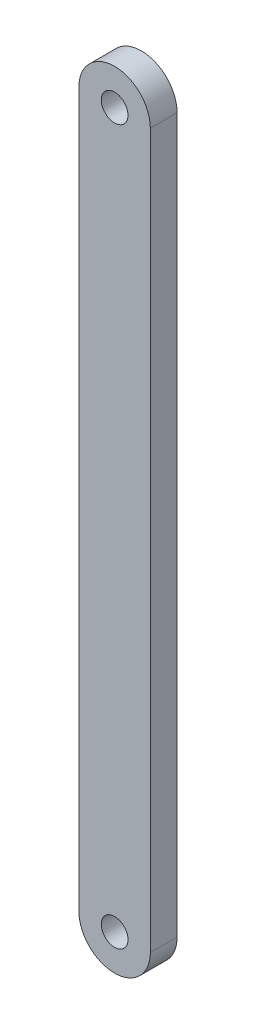
ISO-10303-21;
HEADER;
FILE_DESCRIPTION(('STEP AP214'),'2;1');
FILE_NAME('part.step','',(''),(''),'','','');
FILE_SCHEMA(('AUTOMOTIVE_DESIGN { 1 0 10303 214 1 1 1 1 }'));
ENDSEC;
DATA;
#1=APPLICATION_CONTEXT('core data for automotive mechanical design processes');
#2=APPLICATION_PROTOCOL_DEFINITION('international standard','automotive_design',2000,#1);
#3=PRODUCT_CONTEXT('',#1,'mechanical');
#4=PRODUCT('Part','Part','',(#3));
#5=PRODUCT_RELATED_PRODUCT_CATEGORY('part','',(#4));
#6=PRODUCT_DEFINITION_FORMATION('','',#4);
#7=PRODUCT_DEFINITION_CONTEXT('part definition',#1,'design');
#8=PRODUCT_DEFINITION('design','',#6,#7);
#9=PRODUCT_DEFINITION_SHAPE('','',#8);
#10=(LENGTH_UNIT() NAMED_UNIT(*) SI_UNIT(.MILLI.,.METRE.));
#11=(NAMED_UNIT(*) PLANE_ANGLE_UNIT() SI_UNIT($,.RADIAN.));
#12=(NAMED_UNIT(*) SI_UNIT($,.STERADIAN.) SOLID_ANGLE_UNIT());
#13=UNCERTAINTY_MEASURE_WITH_UNIT(LENGTH_MEASURE(1.E-05),#10,'distance_accuracy_value','');
#14=(GEOMETRIC_REPRESENTATION_CONTEXT(3) GLOBAL_UNCERTAINTY_ASSIGNED_CONTEXT((#13)) GLOBAL_UNIT_ASSIGNED_CONTEXT((#10,
#11,#12)) REPRESENTATION_CONTEXT('',''));
#15=CARTESIAN_POINT('',(0.,0.,0.));
#16=DIRECTION('',(0.,0.,1.));
#17=DIRECTION('',(1.,0.,0.));
#18=AXIS2_PLACEMENT_3D('',#15,#16,#17);
#19=CARTESIAN_POINT('',(44.3000999967361,0.999999998024384,3.));
#20=DIRECTION('',(0.,0.,-1.));
#21=DIRECTION('',(-1.,0.,0.));
#22=AXIS2_PLACEMENT_3D('',#19,#20,#21);
#23=PLANE('',#22);
#24=CARTESIAN_POINT('',(40.3000999980244,5.000000005807,3.));
#25=CARTESIAN_POINT('',(40.3000999936778,2.65685425240754,3.));
#26=CARTESIAN_POINT('',(41.9569542433365,0.999999998991616,3.));
#27=CARTESIAN_POINT('',(44.3000999967361,0.999999998024384,3.));
#28=CARTESIAN_POINT('',(46.6432457501358,0.999999997057152,3.));
#29=CARTESIAN_POINT('',(48.3001000011623,2.65685424910521,3.));
#30=CARTESIAN_POINT('',(48.3000999987502,5.00000000250467,3.));
#31=(BOUNDED_CURVE() B_SPLINE_CURVE(3,(#24,#25,#26,#27,#28,#29,#30),.UNSPECIFIED.,.F.,
.F.) B_SPLINE_CURVE_WITH_KNOTS((4,3,4),(0.,0.5,1.),
.UNSPECIFIED.) CURVE() GEOMETRIC_REPRESENTATION_ITEM() RATIONAL_B_SPLINE_CURVE((1.,
0.80473785378443,0.80473785378443,1.,0.80473785378443,0.80473785378443,1.)) REPRESENTATION_ITEM(''));
#32=CARTESIAN_POINT('',(40.3000999980244,5.000000005807,3.));
#33=VERTEX_POINT('',#32);
#34=CARTESIAN_POINT('',(48.3000999987502,5.00000000250467,3.));
#35=VERTEX_POINT('',#34);
#36=EDGE_CURVE('E85',#33,#35,#31,.T.);
#37=ORIENTED_EDGE('',*,*,#36,.T.);
#38=DIRECTION('',(3.27697938242219E-12,1.,0.));
#39=VECTOR('',#38,1.);
#40=CARTESIAN_POINT('',(48.3000999990123,84.9999999993749,3.));
#41=LINE('',#40,#39);
#42=CARTESIAN_POINT('',(48.3000999990123,84.9999999993749,3.));
#43=VERTEX_POINT('',#42);
#44=EDGE_CURVE('E80',#35,#43,#41,.T.);
#45=ORIENTED_EDGE('',*,*,#44,.T.);
#46=CARTESIAN_POINT('',(44.3000999983873,84.9999999983869,3.));
#47=DIRECTION('',(0.,0.,1.));
#48=DIRECTION('',(1.,0.,0.));
#49=AXIS2_PLACEMENT_3D('',#46,#47,#48);
#50=CIRCLE('',#49,4.00000000062505);
#51=CARTESIAN_POINT('',(40.3000999990123,85.000099999983,3.));
#52=VERTEX_POINT('',#51);
#53=EDGE_CURVE('E83',#43,#52,#50,.T.);
#54=ORIENTED_EDGE('',*,*,#53,.T.);
#55=DIRECTION('',(-1.23485268928075E-11,-1.,0.));
#56=VECTOR('',#55,1.);
#57=CARTESIAN_POINT('',(40.3000999980244,5.000000005807,3.));
#58=LINE('',#57,#56);
#59=EDGE_CURVE('E50',#52,#33,#58,.T.);
#60=ORIENTED_EDGE('',*,*,#59,.T.);
#61=EDGE_LOOP('',(#37,#45,#54,#60));
#62=FACE_BOUND('',#61,.T.);
#63=CARTESIAN_POINT('',(44.3000999983873,4.99999999838695,3.));
#64=DIRECTION('',(0.,0.,1.));
#65=DIRECTION('',(1.,0.,0.));
#66=AXIS2_PLACEMENT_3D('',#63,#64,#65);
#67=CIRCLE('',#66,1.50000000000001);
#68=CARTESIAN_POINT('',(45.8000999983873,4.99999999838695,3.));
#69=VERTEX_POINT('',#68);
#70=EDGE_CURVE('E102',#69,#69,#67,.T.);
#71=ORIENTED_EDGE('',*,*,#70,.F.);
#72=EDGE_LOOP('',(#71));
#73=FACE_BOUND('',#72,.T.);
#74=CARTESIAN_POINT('',(44.3000999983873,84.9999999983869,3.));
#75=DIRECTION('',(0.,0.,1.));
#76=DIRECTION('',(1.,0.,0.));
#77=AXIS2_PLACEMENT_3D('',#74,#75,#76);
#78=CIRCLE('',#77,1.50000000000001);
#79=CARTESIAN_POINT('',(45.8000999983873,84.9999999983869,3.));
#80=VERTEX_POINT('',#79);
#81=EDGE_CURVE('E125',#80,#80,#78,.T.);
#82=ORIENTED_EDGE('',*,*,#81,.F.);
#83=EDGE_LOOP('',(#82));
#84=FACE_BOUND('',#83,.T.);
#85=ADVANCED_FACE('F33',(#62,#73,#84),#23,.F.);
#86=CARTESIAN_POINT('',(44.3000999967361,0.999999998024384,0.));
#87=DIRECTION('',(0.,0.,-1.));
#88=DIRECTION('',(-1.,0.,0.));
#89=AXIS2_PLACEMENT_3D('',#86,#87,#88);
#90=PLANE('',#89);
#91=CARTESIAN_POINT('',(44.3000999983873,4.99999999838695,0.));
#92=DIRECTION('',(0.,0.,1.));
#93=DIRECTION('',(1.,0.,0.));
#94=AXIS2_PLACEMENT_3D('',#91,#92,#93);
#95=CIRCLE('',#94,1.50000000000001);
#96=CARTESIAN_POINT('',(45.8000999983873,4.99999999838695,0.));
#97=VERTEX_POINT('',#96);
#98=EDGE_CURVE('E119',#97,#97,#95,.T.);
#99=ORIENTED_EDGE('',*,*,#98,.T.);
#100=EDGE_LOOP('',(#99));
#101=FACE_BOUND('',#100,.T.);
#102=CARTESIAN_POINT('',(40.3000999980244,5.000000005807,0.));
#103=CARTESIAN_POINT('',(40.3000999936778,2.65685425240754,0.));
#104=CARTESIAN_POINT('',(41.9569542433365,0.999999998991616,0.));
#105=CARTESIAN_POINT('',(44.3000999967361,0.999999998024384,0.));
#106=CARTESIAN_POINT('',(46.6432457501358,0.999999997057152,0.));
#107=CARTESIAN_POINT('',(48.3001000011623,2.65685424910521,0.));
#108=CARTESIAN_POINT('',(48.3000999987502,5.00000000250467,0.));
#109=(BOUNDED_CURVE() B_SPLINE_CURVE(3,(#102,#103,#104,#105,#106,#107,#108),.UNSPECIFIED.,.F.,
.F.) B_SPLINE_CURVE_WITH_KNOTS((4,3,4),(0.,0.5,1.),
.UNSPECIFIED.) CURVE() GEOMETRIC_REPRESENTATION_ITEM() RATIONAL_B_SPLINE_CURVE((1.,
0.80473785378443,0.80473785378443,1.,0.80473785378443,0.80473785378443,1.)) REPRESENTATION_ITEM(''));
#110=CARTESIAN_POINT('',(40.3000999980244,5.000000005807,0.));
#111=VERTEX_POINT('',#110);
#112=CARTESIAN_POINT('',(48.3000999987502,5.00000000250467,0.));
#113=VERTEX_POINT('',#112);
#114=EDGE_CURVE('E97',#111,#113,#109,.T.);
#115=ORIENTED_EDGE('',*,*,#114,.F.);
#116=DIRECTION('',(-1.23485268928075E-11,-1.,0.));
#117=VECTOR('',#116,1.);
#118=CARTESIAN_POINT('',(40.3000999980244,5.000000005807,0.));
#119=LINE('',#118,#117);
#120=CARTESIAN_POINT('',(40.3000999990123,85.000099999983,0.));
#121=VERTEX_POINT('',#120);
#122=EDGE_CURVE('E73',#121,#111,#119,.T.);
#123=ORIENTED_EDGE('',*,*,#122,.F.);
#124=CARTESIAN_POINT('',(44.3000999983873,84.9999999983869,0.));
#125=DIRECTION('',(0.,0.,1.));
#126=DIRECTION('',(1.,0.,0.));
#127=AXIS2_PLACEMENT_3D('',#124,#125,#126);
#128=CIRCLE('',#127,4.00000000062505);
#129=CARTESIAN_POINT('',(48.3000999990123,84.9999999993749,0.));
#130=VERTEX_POINT('',#129);
#131=EDGE_CURVE('E67',#130,#121,#128,.T.);
#132=ORIENTED_EDGE('',*,*,#131,.F.);
#133=DIRECTION('',(3.27697938242219E-12,1.,0.));
#134=VECTOR('',#133,1.);
#135=CARTESIAN_POINT('',(48.3000999990123,84.9999999993749,0.));
#136=LINE('',#135,#134);
#137=EDGE_CURVE('E89',#113,#130,#136,.T.);
#138=ORIENTED_EDGE('',*,*,#137,.F.);
#139=EDGE_LOOP('',(#115,#123,#132,#138));
#140=FACE_BOUND('',#139,.T.);
#141=CARTESIAN_POINT('',(44.3000999983873,84.9999999983869,0.));
#142=DIRECTION('',(0.,0.,1.));
#143=DIRECTION('',(1.,0.,0.));
#144=AXIS2_PLACEMENT_3D('',#141,#142,#143);
#145=CIRCLE('',#144,1.50000000000001);
#146=CARTESIAN_POINT('',(45.8000999983873,84.9999999983869,0.));
#147=VERTEX_POINT('',#146);
#148=EDGE_CURVE('E128',#147,#147,#145,.T.);
#149=ORIENTED_EDGE('',*,*,#148,.T.);
#150=EDGE_LOOP('',(#149));
#151=FACE_BOUND('',#150,.T.);
#152=ADVANCED_FACE('F113',(#101,#140,#151),#90,.T.);
#153=CARTESIAN_POINT('',(44.3000999983873,4.99999999838695,3.));
#154=DIRECTION('',(0.,0.,-1.));
#155=DIRECTION('',(-1.,0.,0.));
#156=AXIS2_PLACEMENT_3D('',#153,#154,#155);
#157=CYLINDRICAL_SURFACE('',#156,4.00000000036273);
#158=ORIENTED_EDGE('',*,*,#114,.T.);
#159=DIRECTION('',(0.,0.,-1.));
#160=VECTOR('',#159,1.);
#161=CARTESIAN_POINT('',(48.3000999987502,5.00000000250467,3.));
#162=LINE('',#161,#160);
#163=EDGE_CURVE('E11',#35,#113,#162,.T.);
#164=ORIENTED_EDGE('',*,*,#163,.F.);
#165=ORIENTED_EDGE('',*,*,#36,.F.);
#166=DIRECTION('',(0.,0.,-1.));
#167=VECTOR('',#166,1.);
#168=CARTESIAN_POINT('',(40.3000999980244,5.000000005807,3.));
#169=LINE('',#168,#167);
#170=EDGE_CURVE('E93',#33,#111,#169,.T.);
#171=ORIENTED_EDGE('',*,*,#170,.T.);
#172=EDGE_LOOP('',(#158,#164,#165,#171));
#173=FACE_BOUND('',#172,.T.);
#174=ADVANCED_FACE('F35',(#173),#157,.T.);
#175=CARTESIAN_POINT('',(48.3000999990123,84.9999999993749,3.));
#176=DIRECTION('',(-1.,3.27697938242219E-12,0.));
#177=DIRECTION('',(-3.27697938242219E-12,-1.,0.));
#178=AXIS2_PLACEMENT_3D('',#175,#176,#177);
#179=PLANE('',#178);
#180=ORIENTED_EDGE('',*,*,#137,.T.);
#181=DIRECTION('',(0.,0.,-1.));
#182=VECTOR('',#181,1.);
#183=CARTESIAN_POINT('',(48.3000999990123,84.9999999993749,3.));
#184=LINE('',#183,#182);
#185=EDGE_CURVE('E42',#43,#130,#184,.T.);
#186=ORIENTED_EDGE('',*,*,#185,.F.);
#187=ORIENTED_EDGE('',*,*,#44,.F.);
#188=ORIENTED_EDGE('',*,*,#163,.T.);
#189=EDGE_LOOP('',(#180,#186,#187,#188));
#190=FACE_BOUND('',#189,.T.);
#191=ADVANCED_FACE('F88',(#190),#179,.F.);
#192=CARTESIAN_POINT('',(44.3000999983873,84.9999999983869,3.));
#193=DIRECTION('',(0.,0.,-1.));
#194=DIRECTION('',(-1.,0.,0.));
#195=AXIS2_PLACEMENT_3D('',#192,#193,#194);
#196=CYLINDRICAL_SURFACE('',#195,4.00000000062505);
#197=ORIENTED_EDGE('',*,*,#131,.T.);
#198=DIRECTION('',(0.,0.,-1.));
#199=VECTOR('',#198,1.);
#200=CARTESIAN_POINT('',(40.3000999990123,85.000099999983,3.));
#201=LINE('',#200,#199);
#202=EDGE_CURVE('E90',#52,#121,#201,.T.);
#203=ORIENTED_EDGE('',*,*,#202,.F.);
#204=ORIENTED_EDGE('',*,*,#53,.F.);
#205=ORIENTED_EDGE('',*,*,#185,.T.);
#206=EDGE_LOOP('',(#197,#203,#204,#205));
#207=FACE_BOUND('',#206,.T.);
#208=ADVANCED_FACE('F91',(#207),#196,.T.);
#209=CARTESIAN_POINT('',(40.3000999980244,5.000000005807,3.));
#210=DIRECTION('',(1.,-1.23485268928075E-11,0.));
#211=DIRECTION('',(1.23485268928075E-11,1.,0.));
#212=AXIS2_PLACEMENT_3D('',#209,#210,#211);
#213=PLANE('',#212);
#214=ORIENTED_EDGE('',*,*,#122,.T.);
#215=ORIENTED_EDGE('',*,*,#170,.F.);
#216=ORIENTED_EDGE('',*,*,#59,.F.);
#217=ORIENTED_EDGE('',*,*,#202,.T.);
#218=EDGE_LOOP('',(#214,#215,#216,#217));
#219=FACE_BOUND('',#218,.T.);
#220=ADVANCED_FACE('F110',(#219),#213,.F.);
#221=CARTESIAN_POINT('',(44.3000999983873,4.99999999838695,3.));
#222=DIRECTION('',(0.,0.,-1.));
#223=DIRECTION('',(-1.,0.,0.));
#224=AXIS2_PLACEMENT_3D('',#221,#222,#223);
#225=CYLINDRICAL_SURFACE('',#224,1.50000000000001);
#226=ORIENTED_EDGE('',*,*,#70,.T.);
#227=EDGE_LOOP('',(#226));
#228=FACE_BOUND('',#227,.T.);
#229=ORIENTED_EDGE('',*,*,#98,.F.);
#230=EDGE_LOOP('',(#229));
#231=FACE_BOUND('',#230,.T.);
#232=ADVANCED_FACE('F145',(#228,#231),#225,.F.);
#233=CARTESIAN_POINT('',(44.3000999983873,84.9999999983869,3.));
#234=DIRECTION('',(0.,0.,-1.));
#235=DIRECTION('',(-1.,0.,0.));
#236=AXIS2_PLACEMENT_3D('',#233,#234,#235);
#237=CYLINDRICAL_SURFACE('',#236,1.50000000000001);
#238=ORIENTED_EDGE('',*,*,#81,.T.);
#239=EDGE_LOOP('',(#238));
#240=FACE_BOUND('',#239,.T.);
#241=ORIENTED_EDGE('',*,*,#148,.F.);
#242=EDGE_LOOP('',(#241));
#243=FACE_BOUND('',#242,.T.);
#244=ADVANCED_FACE('F134',(#240,#243),#237,.F.);
#245=CLOSED_SHELL('',(#85,#152,#174,#191,#208,#220,#232,#244));
#246=MANIFOLD_SOLID_BREP('B2',#245);
#247=ADVANCED_BREP_SHAPE_REPRESENTATION('',(#18,#246),#14);
#248=SHAPE_DEFINITION_REPRESENTATION(#9,#247);
ENDSEC;
END-ISO-10303-21;
